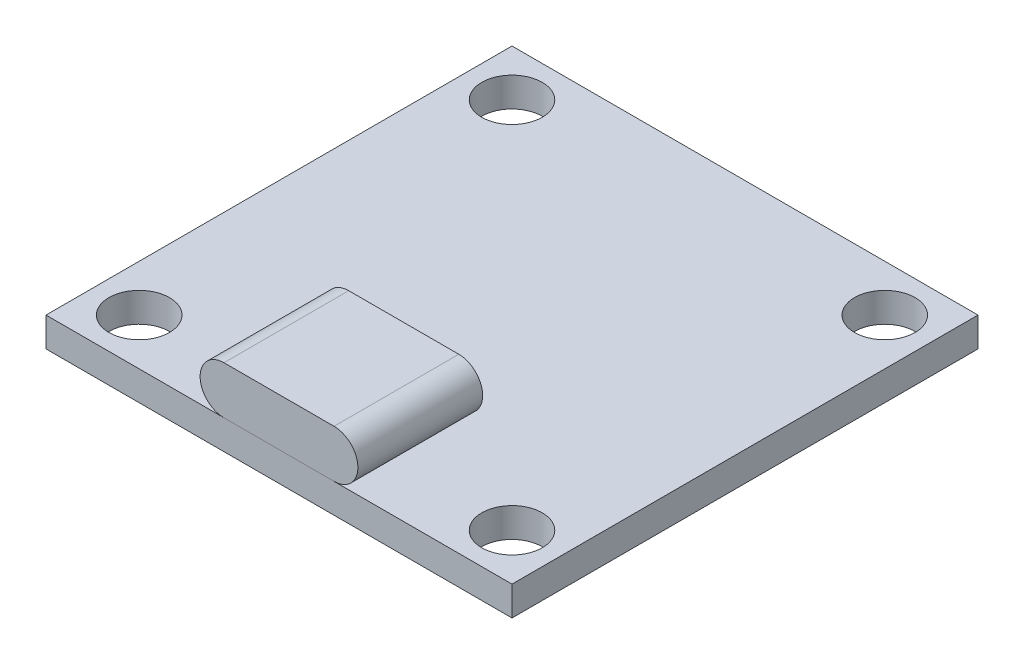
ISO-10303-21;
HEADER;
FILE_DESCRIPTION(('STEP AP214'),'2;1');
FILE_NAME('part.step','',(''),(''),'','','');
FILE_SCHEMA(('AUTOMOTIVE_DESIGN { 1 0 10303 214 1 1 1 1 }'));
ENDSEC;
DATA;
#1=APPLICATION_CONTEXT('core data for automotive mechanical design processes');
#2=APPLICATION_PROTOCOL_DEFINITION('international standard','automotive_design',2000,#1);
#3=PRODUCT_CONTEXT('',#1,'mechanical');
#4=PRODUCT('Part','Part','',(#3));
#5=PRODUCT_RELATED_PRODUCT_CATEGORY('part','',(#4));
#6=PRODUCT_DEFINITION_FORMATION('','',#4);
#7=PRODUCT_DEFINITION_CONTEXT('part definition',#1,'design');
#8=PRODUCT_DEFINITION('design','',#6,#7);
#9=PRODUCT_DEFINITION_SHAPE('','',#8);
#10=(LENGTH_UNIT() NAMED_UNIT(*) SI_UNIT(.MILLI.,.METRE.));
#11=(NAMED_UNIT(*) PLANE_ANGLE_UNIT() SI_UNIT($,.RADIAN.));
#12=(NAMED_UNIT(*) SI_UNIT($,.STERADIAN.) SOLID_ANGLE_UNIT());
#13=UNCERTAINTY_MEASURE_WITH_UNIT(LENGTH_MEASURE(1.E-05),#10,'distance_accuracy_value','');
#14=(GEOMETRIC_REPRESENTATION_CONTEXT(3) GLOBAL_UNCERTAINTY_ASSIGNED_CONTEXT((#13)) GLOBAL_UNIT_ASSIGNED_CONTEXT((#10,
#11,#12)) REPRESENTATION_CONTEXT('',''));
#15=CARTESIAN_POINT('',(0.,0.,0.));
#16=DIRECTION('',(0.,0.,1.));
#17=DIRECTION('',(1.,0.,0.));
#18=AXIS2_PLACEMENT_3D('',#15,#16,#17);
#19=CARTESIAN_POINT('',(-3.,2.1,5.9));
#20=DIRECTION('',(0.,0.,1.));
#21=DIRECTION('',(1.,0.,0.));
#22=AXIS2_PLACEMENT_3D('',#19,#20,#21);
#23=CYLINDRICAL_SURFACE('',#22,1.3);
#24=CARTESIAN_POINT('',(-3.,2.1,12.7));
#25=DIRECTION('',(0.,0.,1.));
#26=DIRECTION('',(1.,0.,0.));
#27=AXIS2_PLACEMENT_3D('',#24,#25,#26);
#28=CIRCLE('',#27,1.3);
#29=CARTESIAN_POINT('',(-3.,3.4,12.7));
#30=VERTEX_POINT('',#29);
#31=CARTESIAN_POINT('',(-3.,0.799999999999999,12.7));
#32=VERTEX_POINT('',#31);
#33=EDGE_CURVE('E113',#30,#32,#28,.T.);
#34=ORIENTED_EDGE('',*,*,#33,.F.);
#35=DIRECTION('',(0.,0.,1.));
#36=VECTOR('',#35,1.);
#37=CARTESIAN_POINT('',(-3.,3.4,5.9));
#38=LINE('',#37,#36);
#39=CARTESIAN_POINT('',(-3.,3.4,5.9));
#40=VERTEX_POINT('',#39);
#41=EDGE_CURVE('E12',#40,#30,#38,.T.);
#42=ORIENTED_EDGE('',*,*,#41,.F.);
#43=CARTESIAN_POINT('',(-3.,2.1,5.9));
#44=DIRECTION('',(0.,0.,1.));
#45=DIRECTION('',(1.,0.,0.));
#46=AXIS2_PLACEMENT_3D('',#43,#44,#45);
#47=CIRCLE('',#46,1.3);
#48=CARTESIAN_POINT('',(-3.,0.799999999999999,5.9));
#49=VERTEX_POINT('',#48);
#50=EDGE_CURVE('E107',#40,#49,#47,.T.);
#51=ORIENTED_EDGE('',*,*,#50,.T.);
#52=DIRECTION('',(0.,0.,1.));
#53=VECTOR('',#52,1.);
#54=CARTESIAN_POINT('',(-3.,0.799999999999999,5.9));
#55=LINE('',#54,#53);
#56=EDGE_CURVE('E52',#49,#32,#55,.T.);
#57=ORIENTED_EDGE('',*,*,#56,.T.);
#58=EDGE_LOOP('',(#34,#42,#51,#57));
#59=FACE_BOUND('',#58,.T.);
#60=ADVANCED_FACE('F49',(#59),#23,.T.);
#61=CARTESIAN_POINT('',(-3.,3.4,5.9));
#62=DIRECTION('',(0.,1.,0.));
#63=DIRECTION('',(0.,0.,1.));
#64=AXIS2_PLACEMENT_3D('',#61,#62,#63);
#65=PLANE('',#64);
#66=DIRECTION('',(-1.,0.,0.));
#67=VECTOR('',#66,1.);
#68=CARTESIAN_POINT('',(-3.,3.4,12.7));
#69=LINE('',#68,#67);
#70=CARTESIAN_POINT('',(3.,3.4,12.7));
#71=VERTEX_POINT('',#70);
#72=EDGE_CURVE('E109',#71,#30,#69,.T.);
#73=ORIENTED_EDGE('',*,*,#72,.F.);
#74=DIRECTION('',(0.,0.,1.));
#75=VECTOR('',#74,1.);
#76=CARTESIAN_POINT('',(3.,3.4,5.9));
#77=LINE('',#76,#75);
#78=CARTESIAN_POINT('',(3.,3.4,5.9));
#79=VERTEX_POINT('',#78);
#80=EDGE_CURVE('E58',#79,#71,#77,.T.);
#81=ORIENTED_EDGE('',*,*,#80,.F.);
#82=DIRECTION('',(-1.,0.,0.));
#83=VECTOR('',#82,1.);
#84=CARTESIAN_POINT('',(-3.,3.4,5.9));
#85=LINE('',#84,#83);
#86=EDGE_CURVE('E104',#79,#40,#85,.T.);
#87=ORIENTED_EDGE('',*,*,#86,.T.);
#88=ORIENTED_EDGE('',*,*,#41,.T.);
#89=EDGE_LOOP('',(#73,#81,#87,#88));
#90=FACE_BOUND('',#89,.T.);
#91=ADVANCED_FACE('F123',(#90),#65,.T.);
#92=CARTESIAN_POINT('',(3.,2.1,5.9));
#93=DIRECTION('',(0.,0.,1.));
#94=DIRECTION('',(1.,0.,0.));
#95=AXIS2_PLACEMENT_3D('',#92,#93,#94);
#96=CYLINDRICAL_SURFACE('',#95,1.3);
#97=CARTESIAN_POINT('',(3.,2.1,12.7));
#98=DIRECTION('',(0.,0.,1.));
#99=DIRECTION('',(1.,0.,0.));
#100=AXIS2_PLACEMENT_3D('',#97,#98,#99);
#101=CIRCLE('',#100,1.3);
#102=CARTESIAN_POINT('',(3.,0.799999999999999,12.7));
#103=VERTEX_POINT('',#102);
#104=EDGE_CURVE('E99',#103,#71,#101,.T.);
#105=ORIENTED_EDGE('',*,*,#104,.F.);
#106=DIRECTION('',(0.,0.,1.));
#107=VECTOR('',#106,1.);
#108=CARTESIAN_POINT('',(3.,0.799999999999999,5.9));
#109=LINE('',#108,#107);
#110=CARTESIAN_POINT('',(3.,0.799999999999999,5.9));
#111=VERTEX_POINT('',#110);
#112=EDGE_CURVE('E94',#111,#103,#109,.T.);
#113=ORIENTED_EDGE('',*,*,#112,.F.);
#114=CARTESIAN_POINT('',(3.,2.1,5.9));
#115=DIRECTION('',(0.,0.,1.));
#116=DIRECTION('',(1.,0.,0.));
#117=AXIS2_PLACEMENT_3D('',#114,#115,#116);
#118=CIRCLE('',#117,1.3);
#119=EDGE_CURVE('E97',#111,#79,#118,.T.);
#120=ORIENTED_EDGE('',*,*,#119,.T.);
#121=ORIENTED_EDGE('',*,*,#80,.T.);
#122=EDGE_LOOP('',(#105,#113,#120,#121));
#123=FACE_BOUND('',#122,.T.);
#124=ADVANCED_FACE('F96',(#123),#96,.T.);
#125=CARTESIAN_POINT('',(-3.,0.799999999999999,5.9));
#126=DIRECTION('',(0.,-1.,0.));
#127=DIRECTION('',(0.,0.,-1.));
#128=AXIS2_PLACEMENT_3D('',#125,#126,#127);
#129=PLANE('',#128);
#130=DIRECTION('',(1.,0.,0.));
#131=VECTOR('',#130,1.);
#132=CARTESIAN_POINT('',(-3.,0.799999999999999,12.7));
#133=LINE('',#132,#131);
#134=EDGE_CURVE('E116',#32,#103,#133,.T.);
#135=ORIENTED_EDGE('',*,*,#134,.F.);
#136=ORIENTED_EDGE('',*,*,#56,.F.);
#137=DIRECTION('',(1.,0.,0.));
#138=VECTOR('',#137,1.);
#139=CARTESIAN_POINT('',(-3.,0.799999999999999,5.9));
#140=LINE('',#139,#138);
#141=EDGE_CURVE('E103',#49,#111,#140,.T.);
#142=ORIENTED_EDGE('',*,*,#141,.T.);
#143=ORIENTED_EDGE('',*,*,#112,.T.);
#144=EDGE_LOOP('',(#135,#136,#142,#143));
#145=FACE_BOUND('',#144,.T.);
#146=ADVANCED_FACE('F106',(#145),#129,.T.);
#147=CARTESIAN_POINT('',(-3.,2.1,5.9));
#148=DIRECTION('',(0.,0.,1.));
#149=DIRECTION('',(1.,0.,0.));
#150=AXIS2_PLACEMENT_3D('',#147,#148,#149);
#151=PLANE('',#150);
#152=ORIENTED_EDGE('',*,*,#50,.F.);
#153=ORIENTED_EDGE('',*,*,#86,.F.);
#154=ORIENTED_EDGE('',*,*,#119,.F.);
#155=ORIENTED_EDGE('',*,*,#141,.F.);
#156=EDGE_LOOP('',(#152,#153,#154,#155));
#157=FACE_BOUND('',#156,.T.);
#158=ADVANCED_FACE('F102',(#157),#151,.F.);
#159=CARTESIAN_POINT('',(-3.,2.1,12.7));
#160=DIRECTION('',(0.,0.,1.));
#161=DIRECTION('',(1.,0.,0.));
#162=AXIS2_PLACEMENT_3D('',#159,#160,#161);
#163=PLANE('',#162);
#164=ORIENTED_EDGE('',*,*,#33,.T.);
#165=ORIENTED_EDGE('',*,*,#134,.T.);
#166=ORIENTED_EDGE('',*,*,#104,.T.);
#167=ORIENTED_EDGE('',*,*,#72,.T.);
#168=EDGE_LOOP('',(#164,#165,#166,#167));
#169=FACE_BOUND('',#168,.T.);
#170=ADVANCED_FACE('F122',(#169),#163,.T.);
#171=CLOSED_SHELL('',(#60,#91,#124,#146,#158,#170));
#172=MANIFOLD_SOLID_BREP('B2',#171);
#173=CARTESIAN_POINT('',(12.7,0.8,-12.7));
#174=DIRECTION('',(-1.,0.,0.));
#175=DIRECTION('',(0.,0.,1.));
#176=AXIS2_PLACEMENT_3D('',#173,#174,#175);
#177=PLANE('',#176);
#178=DIRECTION('',(0.,0.,-1.));
#179=VECTOR('',#178,1.);
#180=CARTESIAN_POINT('',(12.7,-0.8,-12.7));
#181=LINE('',#180,#179);
#182=CARTESIAN_POINT('',(12.7,-0.8,12.7));
#183=VERTEX_POINT('',#182);
#184=CARTESIAN_POINT('',(12.7,-0.8,-12.7));
#185=VERTEX_POINT('',#184);
#186=EDGE_CURVE('E235',#183,#185,#181,.T.);
#187=ORIENTED_EDGE('',*,*,#186,.T.);
#188=DIRECTION('',(0.,-1.,0.));
#189=VECTOR('',#188,1.);
#190=CARTESIAN_POINT('',(12.7,0.8,-12.7));
#191=LINE('',#190,#189);
#192=CARTESIAN_POINT('',(12.7,0.8,-12.7));
#193=VERTEX_POINT('',#192);
#194=EDGE_CURVE('E47',#193,#185,#191,.T.);
#195=ORIENTED_EDGE('',*,*,#194,.F.);
#196=DIRECTION('',(0.,0.,-1.));
#197=VECTOR('',#196,1.);
#198=CARTESIAN_POINT('',(12.7,0.8,-12.7));
#199=LINE('',#198,#197);
#200=CARTESIAN_POINT('',(12.7,0.8,12.7));
#201=VERTEX_POINT('',#200);
#202=EDGE_CURVE('E223',#201,#193,#199,.T.);
#203=ORIENTED_EDGE('',*,*,#202,.F.);
#204=DIRECTION('',(0.,-1.,0.));
#205=VECTOR('',#204,1.);
#206=CARTESIAN_POINT('',(12.7,0.8,12.7));
#207=LINE('',#206,#205);
#208=EDGE_CURVE('E231',#201,#183,#207,.T.);
#209=ORIENTED_EDGE('',*,*,#208,.T.);
#210=EDGE_LOOP('',(#187,#195,#203,#209));
#211=FACE_BOUND('',#210,.T.);
#212=ADVANCED_FACE('F172',(#211),#177,.F.);
#213=CARTESIAN_POINT('',(-12.7,0.8,-12.7));
#214=DIRECTION('',(0.,0.,1.));
#215=DIRECTION('',(1.,0.,0.));
#216=AXIS2_PLACEMENT_3D('',#213,#214,#215);
#217=PLANE('',#216);
#218=DIRECTION('',(-1.,0.,0.));
#219=VECTOR('',#218,1.);
#220=CARTESIAN_POINT('',(-12.7,-0.8,-12.7));
#221=LINE('',#220,#219);
#222=CARTESIAN_POINT('',(-12.7,-0.8,-12.7));
#223=VERTEX_POINT('',#222);
#224=EDGE_CURVE('E227',#185,#223,#221,.T.);
#225=ORIENTED_EDGE('',*,*,#224,.T.);
#226=DIRECTION('',(0.,-1.,0.));
#227=VECTOR('',#226,1.);
#228=CARTESIAN_POINT('',(-12.7,0.8,-12.7));
#229=LINE('',#228,#227);
#230=CARTESIAN_POINT('',(-12.7,0.8,-12.7));
#231=VERTEX_POINT('',#230);
#232=EDGE_CURVE('E180',#231,#223,#229,.T.);
#233=ORIENTED_EDGE('',*,*,#232,.F.);
#234=DIRECTION('',(-1.,0.,0.));
#235=VECTOR('',#234,1.);
#236=CARTESIAN_POINT('',(-12.7,0.8,-12.7));
#237=LINE('',#236,#235);
#238=EDGE_CURVE('E218',#193,#231,#237,.T.);
#239=ORIENTED_EDGE('',*,*,#238,.F.);
#240=ORIENTED_EDGE('',*,*,#194,.T.);
#241=EDGE_LOOP('',(#225,#233,#239,#240));
#242=FACE_BOUND('',#241,.T.);
#243=ADVANCED_FACE('F226',(#242),#217,.F.);
#244=CARTESIAN_POINT('',(-12.7,0.8,-12.7));
#245=DIRECTION('',(1.,0.,0.));
#246=DIRECTION('',(0.,0.,-1.));
#247=AXIS2_PLACEMENT_3D('',#244,#245,#246);
#248=PLANE('',#247);
#249=DIRECTION('',(0.,0.,1.));
#250=VECTOR('',#249,1.);
#251=CARTESIAN_POINT('',(-12.7,-0.8,-12.7));
#252=LINE('',#251,#250);
#253=CARTESIAN_POINT('',(-12.7,-0.8,12.7));
#254=VERTEX_POINT('',#253);
#255=EDGE_CURVE('E205',#223,#254,#252,.T.);
#256=ORIENTED_EDGE('',*,*,#255,.T.);
#257=DIRECTION('',(0.,-1.,0.));
#258=VECTOR('',#257,1.);
#259=CARTESIAN_POINT('',(-12.7,0.8,12.7));
#260=LINE('',#259,#258);
#261=CARTESIAN_POINT('',(-12.7,0.8,12.7));
#262=VERTEX_POINT('',#261);
#263=EDGE_CURVE('E228',#262,#254,#260,.T.);
#264=ORIENTED_EDGE('',*,*,#263,.F.);
#265=DIRECTION('',(0.,0.,1.));
#266=VECTOR('',#265,1.);
#267=CARTESIAN_POINT('',(-12.7,0.8,-12.7));
#268=LINE('',#267,#266);
#269=EDGE_CURVE('E221',#231,#262,#268,.T.);
#270=ORIENTED_EDGE('',*,*,#269,.F.);
#271=ORIENTED_EDGE('',*,*,#232,.T.);
#272=EDGE_LOOP('',(#256,#264,#270,#271));
#273=FACE_BOUND('',#272,.T.);
#274=ADVANCED_FACE('F229',(#273),#248,.F.);
#275=CARTESIAN_POINT('',(-12.7,0.8,12.7));
#276=DIRECTION('',(0.,0.,-1.));
#277=DIRECTION('',(-1.,0.,0.));
#278=AXIS2_PLACEMENT_3D('',#275,#276,#277);
#279=PLANE('',#278);
#280=DIRECTION('',(1.,0.,0.));
#281=VECTOR('',#280,1.);
#282=CARTESIAN_POINT('',(-12.7,-0.8,12.7));
#283=LINE('',#282,#281);
#284=EDGE_CURVE('E211',#254,#183,#283,.T.);
#285=ORIENTED_EDGE('',*,*,#284,.T.);
#286=ORIENTED_EDGE('',*,*,#208,.F.);
#287=DIRECTION('',(1.,0.,0.));
#288=VECTOR('',#287,1.);
#289=CARTESIAN_POINT('',(-12.7,0.8,12.7));
#290=LINE('',#289,#288);
#291=EDGE_CURVE('E188',#262,#201,#290,.T.);
#292=ORIENTED_EDGE('',*,*,#291,.F.);
#293=ORIENTED_EDGE('',*,*,#263,.T.);
#294=EDGE_LOOP('',(#285,#286,#292,#293));
#295=FACE_BOUND('',#294,.T.);
#296=ADVANCED_FACE('F243',(#295),#279,.F.);
#297=CARTESIAN_POINT('',(0.,0.8,0.));
#298=DIRECTION('',(0.,1.,0.));
#299=DIRECTION('',(0.,0.,1.));
#300=AXIS2_PLACEMENT_3D('',#297,#298,#299);
#301=PLANE('',#300);
#302=CARTESIAN_POINT('',(10.16,0.8,10.16));
#303=DIRECTION('',(0.,1.,0.));
#304=DIRECTION('',(0.,0.,1.));
#305=AXIS2_PLACEMENT_3D('',#302,#303,#304);
#306=CIRCLE('',#305,1.65);
#307=CARTESIAN_POINT('',(10.16,0.8,11.81));
#308=VERTEX_POINT('',#307);
#309=EDGE_CURVE('E265',#308,#308,#306,.T.);
#310=ORIENTED_EDGE('',*,*,#309,.F.);
#311=EDGE_LOOP('',(#310));
#312=FACE_BOUND('',#311,.T.);
#313=CARTESIAN_POINT('',(-10.16,0.8,-10.16));
#314=DIRECTION('',(0.,1.,0.));
#315=DIRECTION('',(0.,0.,1.));
#316=AXIS2_PLACEMENT_3D('',#313,#314,#315);
#317=CIRCLE('',#316,1.65);
#318=CARTESIAN_POINT('',(-10.16,0.8,-8.51));
#319=VERTEX_POINT('',#318);
#320=EDGE_CURVE('E258',#319,#319,#317,.T.);
#321=ORIENTED_EDGE('',*,*,#320,.F.);
#322=EDGE_LOOP('',(#321));
#323=FACE_BOUND('',#322,.T.);
#324=CARTESIAN_POINT('',(10.16,0.8,-10.16));
#325=DIRECTION('',(0.,1.,0.));
#326=DIRECTION('',(0.,0.,1.));
#327=AXIS2_PLACEMENT_3D('',#324,#325,#326);
#328=CIRCLE('',#327,1.65);
#329=CARTESIAN_POINT('',(10.16,0.8,-8.51));
#330=VERTEX_POINT('',#329);
#331=EDGE_CURVE('E259',#330,#330,#328,.T.);
#332=ORIENTED_EDGE('',*,*,#331,.F.);
#333=EDGE_LOOP('',(#332));
#334=FACE_BOUND('',#333,.T.);
#335=CARTESIAN_POINT('',(-10.16,0.8,10.16));
#336=DIRECTION('',(0.,1.,0.));
#337=DIRECTION('',(0.,0.,1.));
#338=AXIS2_PLACEMENT_3D('',#335,#336,#337);
#339=CIRCLE('',#338,1.65);
#340=CARTESIAN_POINT('',(-10.16,0.8,11.81));
#341=VERTEX_POINT('',#340);
#342=EDGE_CURVE('E251',#341,#341,#339,.T.);
#343=ORIENTED_EDGE('',*,*,#342,.F.);
#344=EDGE_LOOP('',(#343));
#345=FACE_BOUND('',#344,.T.);
#346=ORIENTED_EDGE('',*,*,#202,.T.);
#347=ORIENTED_EDGE('',*,*,#238,.T.);
#348=ORIENTED_EDGE('',*,*,#269,.T.);
#349=ORIENTED_EDGE('',*,*,#291,.T.);
#350=EDGE_LOOP('',(#346,#347,#348,#349));
#351=FACE_BOUND('',#350,.T.);
#352=ADVANCED_FACE('F219',(#312,#323,#334,#345,#351),#301,.T.);
#353=CARTESIAN_POINT('',(0.,-0.8,0.));
#354=DIRECTION('',(0.,1.,0.));
#355=DIRECTION('',(0.,0.,1.));
#356=AXIS2_PLACEMENT_3D('',#353,#354,#355);
#357=PLANE('',#356);
#358=CARTESIAN_POINT('',(10.16,-0.8,10.16));
#359=DIRECTION('',(0.,1.,0.));
#360=DIRECTION('',(0.,0.,1.));
#361=AXIS2_PLACEMENT_3D('',#358,#359,#360);
#362=CIRCLE('',#361,1.65);
#363=CARTESIAN_POINT('',(10.16,-0.8,11.81));
#364=VERTEX_POINT('',#363);
#365=EDGE_CURVE('E254',#364,#364,#362,.F.);
#366=ORIENTED_EDGE('',*,*,#365,.F.);
#367=EDGE_LOOP('',(#366));
#368=FACE_BOUND('',#367,.T.);
#369=CARTESIAN_POINT('',(-10.16,-0.8,-10.16));
#370=DIRECTION('',(0.,1.,0.));
#371=DIRECTION('',(0.,0.,1.));
#372=AXIS2_PLACEMENT_3D('',#369,#370,#371);
#373=CIRCLE('',#372,1.65);
#374=CARTESIAN_POINT('',(-10.16,-0.8,-8.51));
#375=VERTEX_POINT('',#374);
#376=EDGE_CURVE('E262',#375,#375,#373,.F.);
#377=ORIENTED_EDGE('',*,*,#376,.F.);
#378=EDGE_LOOP('',(#377));
#379=FACE_BOUND('',#378,.T.);
#380=CARTESIAN_POINT('',(10.16,-0.8,-10.16));
#381=DIRECTION('',(0.,1.,0.));
#382=DIRECTION('',(0.,0.,1.));
#383=AXIS2_PLACEMENT_3D('',#380,#381,#382);
#384=CIRCLE('',#383,1.65);
#385=CARTESIAN_POINT('',(10.16,-0.8,-8.51));
#386=VERTEX_POINT('',#385);
#387=EDGE_CURVE('E255',#386,#386,#384,.F.);
#388=ORIENTED_EDGE('',*,*,#387,.F.);
#389=EDGE_LOOP('',(#388));
#390=FACE_BOUND('',#389,.T.);
#391=CARTESIAN_POINT('',(-10.16,-0.8,10.16));
#392=DIRECTION('',(0.,1.,0.));
#393=DIRECTION('',(0.,0.,1.));
#394=AXIS2_PLACEMENT_3D('',#391,#392,#393);
#395=CIRCLE('',#394,1.65);
#396=CARTESIAN_POINT('',(-10.16,-0.8,11.81));
#397=VERTEX_POINT('',#396);
#398=EDGE_CURVE('E238',#397,#397,#395,.F.);
#399=ORIENTED_EDGE('',*,*,#398,.F.);
#400=EDGE_LOOP('',(#399));
#401=FACE_BOUND('',#400,.T.);
#402=ORIENTED_EDGE('',*,*,#186,.F.);
#403=ORIENTED_EDGE('',*,*,#284,.F.);
#404=ORIENTED_EDGE('',*,*,#255,.F.);
#405=ORIENTED_EDGE('',*,*,#224,.F.);
#406=EDGE_LOOP('',(#402,#403,#404,#405));
#407=FACE_BOUND('',#406,.T.);
#408=ADVANCED_FACE('F246',(#368,#379,#390,#401,#407),#357,.F.);
#409=CARTESIAN_POINT('',(-10.16,-0.801,10.16));
#410=DIRECTION('',(0.,1.,0.));
#411=DIRECTION('',(0.,0.,1.));
#412=AXIS2_PLACEMENT_3D('',#409,#410,#411);
#413=CYLINDRICAL_SURFACE('',#412,1.65);
#414=ORIENTED_EDGE('',*,*,#342,.T.);
#415=EDGE_LOOP('',(#414));
#416=FACE_BOUND('',#415,.T.);
#417=ORIENTED_EDGE('',*,*,#398,.T.);
#418=EDGE_LOOP('',(#417));
#419=FACE_BOUND('',#418,.T.);
#420=ADVANCED_FACE('F285',(#416,#419),#413,.F.);
#421=CARTESIAN_POINT('',(10.16,-0.801,-10.16));
#422=DIRECTION('',(0.,1.,0.));
#423=DIRECTION('',(0.,0.,1.));
#424=AXIS2_PLACEMENT_3D('',#421,#422,#423);
#425=CYLINDRICAL_SURFACE('',#424,1.65);
#426=ORIENTED_EDGE('',*,*,#331,.T.);
#427=EDGE_LOOP('',(#426));
#428=FACE_BOUND('',#427,.T.);
#429=ORIENTED_EDGE('',*,*,#387,.T.);
#430=EDGE_LOOP('',(#429));
#431=FACE_BOUND('',#430,.T.);
#432=ADVANCED_FACE('F288',(#428,#431),#425,.F.);
#433=CARTESIAN_POINT('',(-10.16,-0.801,-10.16));
#434=DIRECTION('',(0.,1.,0.));
#435=DIRECTION('',(0.,0.,1.));
#436=AXIS2_PLACEMENT_3D('',#433,#434,#435);
#437=CYLINDRICAL_SURFACE('',#436,1.65);
#438=ORIENTED_EDGE('',*,*,#320,.T.);
#439=EDGE_LOOP('',(#438));
#440=FACE_BOUND('',#439,.T.);
#441=ORIENTED_EDGE('',*,*,#376,.T.);
#442=EDGE_LOOP('',(#441));
#443=FACE_BOUND('',#442,.T.);
#444=ADVANCED_FACE('F337',(#440,#443),#437,.F.);
#445=CARTESIAN_POINT('',(10.16,-0.801,10.16));
#446=DIRECTION('',(0.,1.,0.));
#447=DIRECTION('',(0.,0.,1.));
#448=AXIS2_PLACEMENT_3D('',#445,#446,#447);
#449=CYLINDRICAL_SURFACE('',#448,1.65);
#450=ORIENTED_EDGE('',*,*,#309,.T.);
#451=EDGE_LOOP('',(#450));
#452=FACE_BOUND('',#451,.T.);
#453=ORIENTED_EDGE('',*,*,#365,.T.);
#454=EDGE_LOOP('',(#453));
#455=FACE_BOUND('',#454,.T.);
#456=ADVANCED_FACE('F273',(#452,#455),#449,.F.);
#457=CLOSED_SHELL('',(#212,#243,#274,#296,#352,#408,#420,#432,#444,#456));
#458=MANIFOLD_SOLID_BREP('B6',#457);
#459=ADVANCED_BREP_SHAPE_REPRESENTATION('',(#18,#172,#458),#14);
#460=SHAPE_DEFINITION_REPRESENTATION(#9,#459);
ENDSEC;
END-ISO-10303-21;
